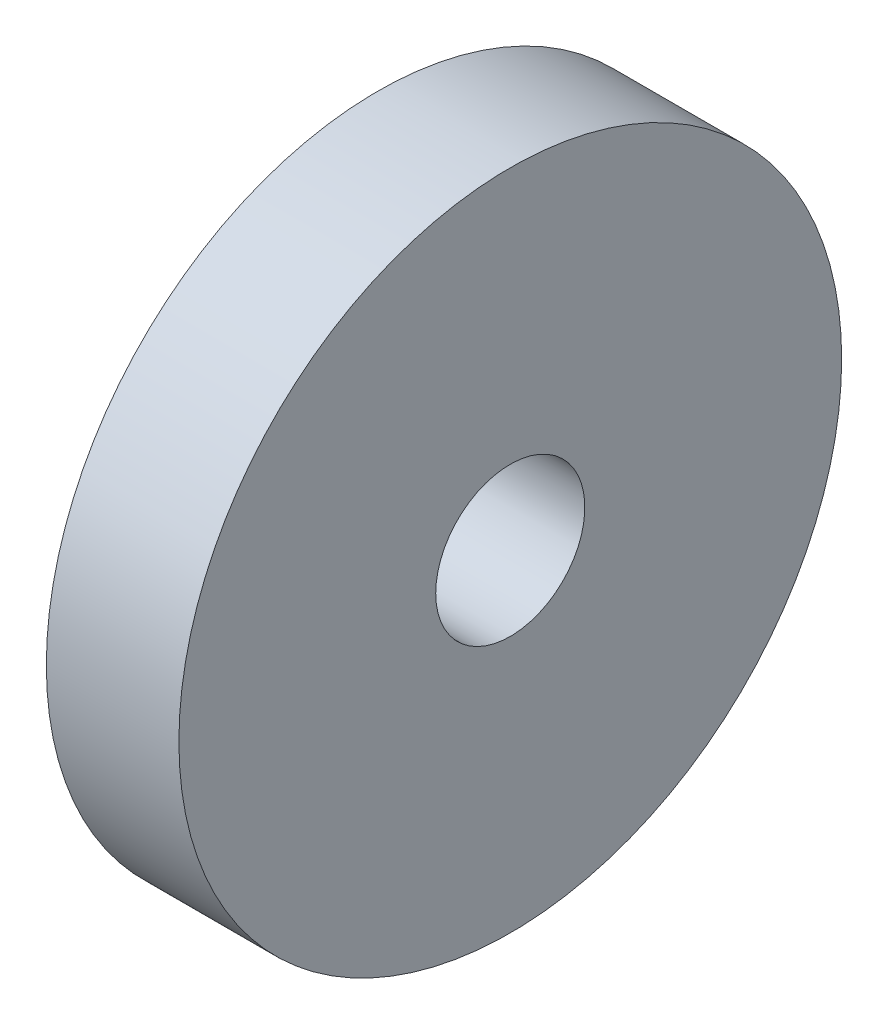
ISO-10303-21;
HEADER;
FILE_DESCRIPTION(('STEP AP214'),'2;1');
FILE_NAME('part.step','',(''),(''),'','','');
FILE_SCHEMA(('AUTOMOTIVE_DESIGN { 1 0 10303 214 1 1 1 1 }'));
ENDSEC;
DATA;
#1=APPLICATION_CONTEXT('core data for automotive mechanical design processes');
#2=APPLICATION_PROTOCOL_DEFINITION('international standard','automotive_design',2000,#1);
#3=PRODUCT_CONTEXT('',#1,'mechanical');
#4=PRODUCT('Part','Part','',(#3));
#5=PRODUCT_RELATED_PRODUCT_CATEGORY('part','',(#4));
#6=PRODUCT_DEFINITION_FORMATION('','',#4);
#7=PRODUCT_DEFINITION_CONTEXT('part definition',#1,'design');
#8=PRODUCT_DEFINITION('design','',#6,#7);
#9=PRODUCT_DEFINITION_SHAPE('','',#8);
#10=(LENGTH_UNIT() NAMED_UNIT(*) SI_UNIT(.MILLI.,.METRE.));
#11=(NAMED_UNIT(*) PLANE_ANGLE_UNIT() SI_UNIT($,.RADIAN.));
#12=(NAMED_UNIT(*) SI_UNIT($,.STERADIAN.) SOLID_ANGLE_UNIT());
#13=UNCERTAINTY_MEASURE_WITH_UNIT(LENGTH_MEASURE(1.E-05),#10,'distance_accuracy_value','');
#14=(GEOMETRIC_REPRESENTATION_CONTEXT(3) GLOBAL_UNCERTAINTY_ASSIGNED_CONTEXT((#13)) GLOBAL_UNIT_ASSIGNED_CONTEXT((#10,
#11,#12)) REPRESENTATION_CONTEXT('',''));
#15=CARTESIAN_POINT('',(0.,0.,0.));
#16=DIRECTION('',(0.,0.,1.));
#17=DIRECTION('',(1.,0.,0.));
#18=AXIS2_PLACEMENT_3D('',#15,#16,#17);
#19=CARTESIAN_POINT('',(8.,0.,0.));
#20=DIRECTION('',(-1.,0.,0.));
#21=DIRECTION('',(0.,0.,1.));
#22=AXIS2_PLACEMENT_3D('',#19,#20,#21);
#23=CYLINDRICAL_SURFACE('',#22,10.);
#24=CARTESIAN_POINT('',(6.,0.,0.));
#25=DIRECTION('',(1.,0.,0.));
#26=DIRECTION('',(0.,0.,-1.));
#27=AXIS2_PLACEMENT_3D('',#24,#25,#26);
#28=CIRCLE('',#27,10.);
#29=CARTESIAN_POINT('',(6.,0.,-10.));
#30=VERTEX_POINT('',#29);
#31=EDGE_CURVE('E10',#30,#30,#28,.T.);
#32=ORIENTED_EDGE('',*,*,#31,.F.);
#33=EDGE_LOOP('',(#32));
#34=FACE_BOUND('',#33,.T.);
#35=CARTESIAN_POINT('',(2.,0.,0.));
#36=DIRECTION('',(-1.,0.,0.));
#37=DIRECTION('',(0.,0.,1.));
#38=AXIS2_PLACEMENT_3D('',#35,#36,#37);
#39=CIRCLE('',#38,10.);
#40=CARTESIAN_POINT('',(2.,0.,10.));
#41=VERTEX_POINT('',#40);
#42=EDGE_CURVE('E40',#41,#41,#39,.T.);
#43=ORIENTED_EDGE('',*,*,#42,.F.);
#44=EDGE_LOOP('',(#43));
#45=FACE_BOUND('',#44,.T.);
#46=ADVANCED_FACE('F33',(#34,#45),#23,.T.);
#47=CARTESIAN_POINT('',(6.,0.,0.));
#48=DIRECTION('',(1.,0.,0.));
#49=DIRECTION('',(0.,0.,-1.));
#50=AXIS2_PLACEMENT_3D('',#47,#48,#49);
#51=PLANE('',#50);
#52=CARTESIAN_POINT('',(6.,0.,0.));
#53=DIRECTION('',(-1.,0.,0.));
#54=DIRECTION('',(0.,0.,1.));
#55=AXIS2_PLACEMENT_3D('',#52,#53,#54);
#56=CIRCLE('',#55,2.25);
#57=CARTESIAN_POINT('',(6.,0.,2.25));
#58=VERTEX_POINT('',#57);
#59=EDGE_CURVE('E46',#58,#58,#56,.T.);
#60=ORIENTED_EDGE('',*,*,#59,.T.);
#61=EDGE_LOOP('',(#60));
#62=FACE_BOUND('',#61,.T.);
#63=ORIENTED_EDGE('',*,*,#31,.T.);
#64=EDGE_LOOP('',(#63));
#65=FACE_BOUND('',#64,.T.);
#66=ADVANCED_FACE('F59',(#62,#65),#51,.T.);
#67=CARTESIAN_POINT('',(2.,0.,0.));
#68=DIRECTION('',(-1.,0.,0.));
#69=DIRECTION('',(0.,0.,1.));
#70=AXIS2_PLACEMENT_3D('',#67,#68,#69);
#71=PLANE('',#70);
#72=CARTESIAN_POINT('',(2.,0.,0.));
#73=DIRECTION('',(-1.,0.,0.));
#74=DIRECTION('',(0.,0.,1.));
#75=AXIS2_PLACEMENT_3D('',#72,#73,#74);
#76=CIRCLE('',#75,2.25);
#77=CARTESIAN_POINT('',(2.,0.,2.25));
#78=VERTEX_POINT('',#77);
#79=EDGE_CURVE('E36',#78,#78,#76,.T.);
#80=ORIENTED_EDGE('',*,*,#79,.F.);
#81=EDGE_LOOP('',(#80));
#82=FACE_BOUND('',#81,.T.);
#83=ORIENTED_EDGE('',*,*,#42,.T.);
#84=EDGE_LOOP('',(#83));
#85=FACE_BOUND('',#84,.T.);
#86=ADVANCED_FACE('F56',(#82,#85),#71,.T.);
#87=CARTESIAN_POINT('',(6.,0.,0.));
#88=DIRECTION('',(-1.,0.,0.));
#89=DIRECTION('',(0.,0.,1.));
#90=AXIS2_PLACEMENT_3D('',#87,#88,#89);
#91=CYLINDRICAL_SURFACE('',#90,2.25);
#92=ORIENTED_EDGE('',*,*,#79,.T.);
#93=EDGE_LOOP('',(#92));
#94=FACE_BOUND('',#93,.T.);
#95=ORIENTED_EDGE('',*,*,#59,.F.);
#96=EDGE_LOOP('',(#95));
#97=FACE_BOUND('',#96,.T.);
#98=ADVANCED_FACE('F53',(#94,#97),#91,.F.);
#99=CLOSED_SHELL('',(#46,#66,#86,#98));
#100=MANIFOLD_SOLID_BREP('B2',#99);
#101=ADVANCED_BREP_SHAPE_REPRESENTATION('',(#18,#100),#14);
#102=SHAPE_DEFINITION_REPRESENTATION(#9,#101);
ENDSEC;
END-ISO-10303-21;
